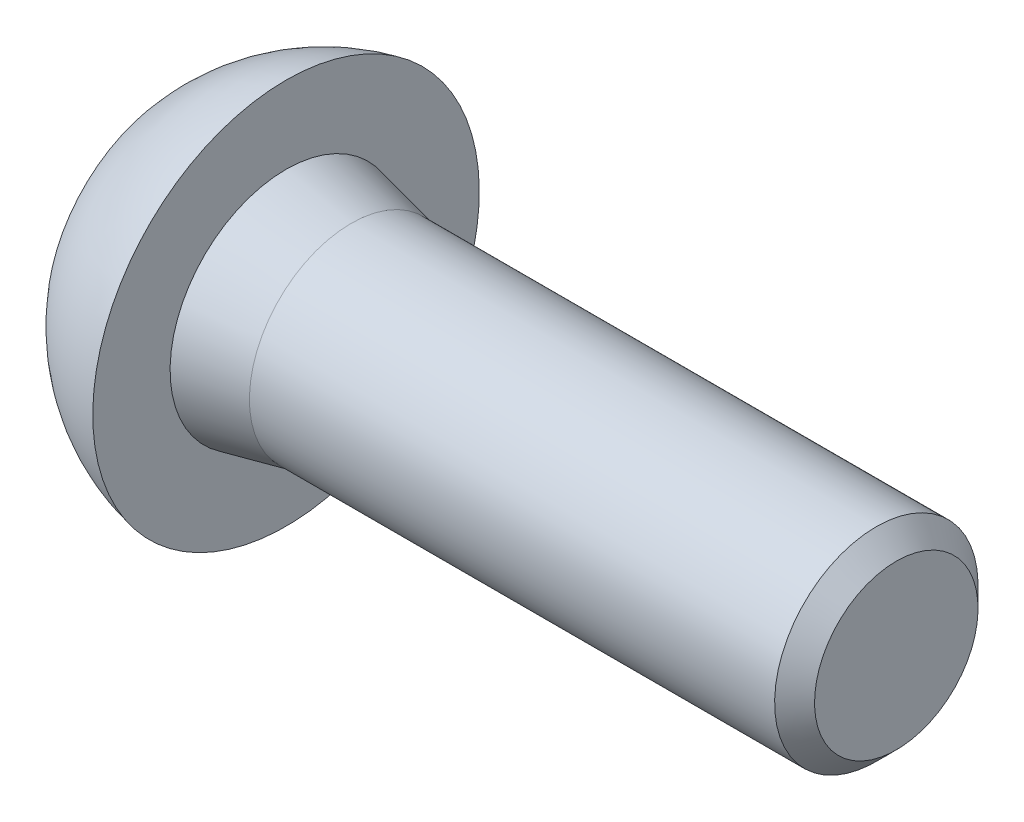
ISO-10303-21;
HEADER;
FILE_DESCRIPTION(('STEP AP214'),'2;1');
FILE_NAME('part.step','',(''),(''),'','','');
FILE_SCHEMA(('AUTOMOTIVE_DESIGN { 1 0 10303 214 1 1 1 1 }'));
ENDSEC;
DATA;
#1=APPLICATION_CONTEXT('core data for automotive mechanical design processes');
#2=APPLICATION_PROTOCOL_DEFINITION('international standard','automotive_design',2000,#1);
#3=PRODUCT_CONTEXT('',#1,'mechanical');
#4=PRODUCT('Part','Part','',(#3));
#5=PRODUCT_RELATED_PRODUCT_CATEGORY('part','',(#4));
#6=PRODUCT_DEFINITION_FORMATION('','',#4);
#7=PRODUCT_DEFINITION_CONTEXT('part definition',#1,'design');
#8=PRODUCT_DEFINITION('design','',#6,#7);
#9=PRODUCT_DEFINITION_SHAPE('','',#8);
#10=(LENGTH_UNIT() NAMED_UNIT(*) SI_UNIT(.MILLI.,.METRE.));
#11=(NAMED_UNIT(*) PLANE_ANGLE_UNIT() SI_UNIT($,.RADIAN.));
#12=(NAMED_UNIT(*) SI_UNIT($,.STERADIAN.) SOLID_ANGLE_UNIT());
#13=UNCERTAINTY_MEASURE_WITH_UNIT(LENGTH_MEASURE(1.E-05),#10,'distance_accuracy_value','');
#14=(GEOMETRIC_REPRESENTATION_CONTEXT(3) GLOBAL_UNCERTAINTY_ASSIGNED_CONTEXT((#13)) GLOBAL_UNIT_ASSIGNED_CONTEXT((#10,
#11,#12)) REPRESENTATION_CONTEXT('',''));
#15=CARTESIAN_POINT('',(0.,0.,0.));
#16=DIRECTION('',(0.,0.,1.));
#17=DIRECTION('',(1.,0.,0.));
#18=AXIS2_PLACEMENT_3D('',#15,#16,#17);
#19=CARTESIAN_POINT('',(-2.75,1.5,0.));
#20=DIRECTION('',(1.,0.,0.));
#21=DIRECTION('',(0.,1.,0.));
#22=AXIS2_PLACEMENT_3D('',#19,#20,#21);
#23=PLANE('',#22);
#24=CARTESIAN_POINT('',(-2.75,0.,0.));
#25=DIRECTION('',(1.,0.,0.));
#26=DIRECTION('',(0.,1.,0.));
#27=AXIS2_PLACEMENT_3D('',#24,#25,#26);
#28=CIRCLE('',#27,3.125);
#29=CARTESIAN_POINT('',(-2.75,3.125,0.));
#30=VERTEX_POINT('',#29);
#31=EDGE_CURVE('E134',#30,#30,#28,.T.);
#32=ORIENTED_EDGE('',*,*,#31,.F.);
#33=EDGE_LOOP('',(#32));
#34=FACE_BOUND('',#33,.T.);
#35=DIRECTION('',(0.,-0.5,0.866025403784439));
#36=VECTOR('',#35,1.);
#37=CARTESIAN_POINT('',(-2.75,-0.924038105676658,-1.39951905283833));
#38=LINE('',#37,#36);
#39=CARTESIAN_POINT('',(-2.75,-0.866025403784439,-1.5));
#40=VERTEX_POINT('',#39);
#41=CARTESIAN_POINT('',(-2.75,-1.73205080756888,0.));
#42=VERTEX_POINT('',#41);
#43=EDGE_CURVE('E11',#40,#42,#38,.T.);
#44=ORIENTED_EDGE('',*,*,#43,.F.);
#45=DIRECTION('',(0.,-1.,0.));
#46=VECTOR('',#45,1.);
#47=CARTESIAN_POINT('',(-2.75,1.5,-1.5));
#48=LINE('',#47,#46);
#49=CARTESIAN_POINT('',(-2.75,0.866025403784438,-1.5));
#50=VERTEX_POINT('',#49);
#51=EDGE_CURVE('E147',#50,#40,#48,.T.);
#52=ORIENTED_EDGE('',*,*,#51,.F.);
#53=DIRECTION('',(0.,-0.5,-0.866025403784439));
#54=VECTOR('',#53,1.);
#55=CARTESIAN_POINT('',(-2.75,1.67403810567666,-0.100480947161671));
#56=LINE('',#55,#54);
#57=CARTESIAN_POINT('',(-2.75,1.73205080756888,0.));
#58=VERTEX_POINT('',#57);
#59=EDGE_CURVE('E143',#58,#50,#56,.T.);
#60=ORIENTED_EDGE('',*,*,#59,.F.);
#61=DIRECTION('',(0.,0.5,-0.866025403784439));
#62=VECTOR('',#61,1.);
#63=CARTESIAN_POINT('',(-2.75,1.67403810567666,0.100480947161671));
#64=LINE('',#63,#62);
#65=CARTESIAN_POINT('',(-2.75,0.866025403784439,1.5));
#66=VERTEX_POINT('',#65);
#67=EDGE_CURVE('E140',#66,#58,#64,.T.);
#68=ORIENTED_EDGE('',*,*,#67,.F.);
#69=DIRECTION('',(0.,1.,0.));
#70=VECTOR('',#69,1.);
#71=CARTESIAN_POINT('',(-2.75,1.5,1.5));
#72=LINE('',#71,#70);
#73=CARTESIAN_POINT('',(-2.75,-0.866025403784439,1.5));
#74=VERTEX_POINT('',#73);
#75=EDGE_CURVE('E145',#74,#66,#72,.T.);
#76=ORIENTED_EDGE('',*,*,#75,.F.);
#77=DIRECTION('',(0.,0.5,0.866025403784439));
#78=VECTOR('',#77,1.);
#79=CARTESIAN_POINT('',(-2.75,-0.924038105676658,1.39951905283833));
#80=LINE('',#79,#78);
#81=EDGE_CURVE('E24',#42,#74,#80,.T.);
#82=ORIENTED_EDGE('',*,*,#81,.F.);
#83=EDGE_LOOP('',(#44,#52,#60,#68,#76,#82));
#84=FACE_BOUND('',#83,.T.);
#85=ADVANCED_FACE('F16',(#34,#84),#23,.F.);
#86=CARTESIAN_POINT('',(0.900773085666185,0.,0.));
#87=DIRECTION('',(1.,0.,0.));
#88=DIRECTION('',(0.,1.,0.));
#89=AXIS2_PLACEMENT_3D('',#86,#87,#88);
#90=DEGENERATE_TOROIDAL_SURFACE('',#89,0.0861917011802991,4.75000000000001,.T.);
#91=ORIENTED_EDGE('',*,*,#31,.T.);
#92=EDGE_LOOP('',(#91));
#93=FACE_BOUND('',#92,.T.);
#94=CARTESIAN_POINT('',(0.,0.,0.));
#95=DIRECTION('',(1.,0.,0.));
#96=DIRECTION('',(0.,1.,0.));
#97=AXIS2_PLACEMENT_3D('',#94,#95,#96);
#98=CIRCLE('',#97,4.75);
#99=CARTESIAN_POINT('',(0.,4.75,0.));
#100=VERTEX_POINT('',#99);
#101=EDGE_CURVE('E131',#100,#100,#98,.T.);
#102=ORIENTED_EDGE('',*,*,#101,.F.);
#103=EDGE_LOOP('',(#102));
#104=FACE_BOUND('',#103,.T.);
#105=ADVANCED_FACE('F219',(#93,#104),#90,.T.);
#106=CARTESIAN_POINT('',(0.,4.75,0.));
#107=DIRECTION('',(-1.,0.,0.));
#108=DIRECTION('',(0.,-1.,0.));
#109=AXIS2_PLACEMENT_3D('',#106,#107,#108);
#110=PLANE('',#109);
#111=CARTESIAN_POINT('',(0.,0.,0.));
#112=DIRECTION('',(1.,0.,0.));
#113=DIRECTION('',(0.,1.,0.));
#114=AXIS2_PLACEMENT_3D('',#111,#112,#113);
#115=CIRCLE('',#114,2.85);
#116=CARTESIAN_POINT('',(0.,2.85,0.));
#117=VERTEX_POINT('',#116);
#118=EDGE_CURVE('E128',#117,#117,#115,.T.);
#119=ORIENTED_EDGE('',*,*,#118,.F.);
#120=EDGE_LOOP('',(#119));
#121=FACE_BOUND('',#120,.T.);
#122=ORIENTED_EDGE('',*,*,#101,.T.);
#123=EDGE_LOOP('',(#122));
#124=FACE_BOUND('',#123,.T.);
#125=ADVANCED_FACE('F224',(#121,#124),#110,.F.);
#126=CARTESIAN_POINT('',(0.,0.,0.));
#127=DIRECTION('',(-1.,0.,0.));
#128=DIRECTION('',(0.,-1.,0.));
#129=AXIS2_PLACEMENT_3D('',#126,#127,#128);
#130=CONICAL_SURFACE('',#129,2.85,0.215357699697738);
#131=CARTESIAN_POINT('',(1.6,0.,0.));
#132=DIRECTION('',(1.,0.,0.));
#133=DIRECTION('',(0.,1.,0.));
#134=AXIS2_PLACEMENT_3D('',#131,#132,#133);
#135=CIRCLE('',#134,2.5);
#136=CARTESIAN_POINT('',(1.6,2.5,0.));
#137=VERTEX_POINT('',#136);
#138=EDGE_CURVE('E125',#137,#137,#135,.T.);
#139=ORIENTED_EDGE('',*,*,#138,.F.);
#140=EDGE_LOOP('',(#139));
#141=FACE_BOUND('',#140,.T.);
#142=ORIENTED_EDGE('',*,*,#118,.T.);
#143=EDGE_LOOP('',(#142));
#144=FACE_BOUND('',#143,.T.);
#145=ADVANCED_FACE('F231',(#141,#144),#130,.T.);
#146=CARTESIAN_POINT('',(15.,0.,0.));
#147=DIRECTION('',(1.,0.,0.));
#148=DIRECTION('',(0.,1.,0.));
#149=AXIS2_PLACEMENT_3D('',#146,#147,#148);
#150=CYLINDRICAL_SURFACE('',#149,2.5);
#151=CARTESIAN_POINT('',(14.5095,0.,0.));
#152=DIRECTION('',(1.,0.,0.));
#153=DIRECTION('',(0.,1.,0.));
#154=AXIS2_PLACEMENT_3D('',#151,#152,#153);
#155=CIRCLE('',#154,2.5);
#156=CARTESIAN_POINT('',(14.5095,2.5,0.));
#157=VERTEX_POINT('',#156);
#158=EDGE_CURVE('E117',#157,#157,#155,.T.);
#159=ORIENTED_EDGE('',*,*,#158,.F.);
#160=EDGE_LOOP('',(#159));
#161=FACE_BOUND('',#160,.T.);
#162=ORIENTED_EDGE('',*,*,#138,.T.);
#163=EDGE_LOOP('',(#162));
#164=FACE_BOUND('',#163,.T.);
#165=ADVANCED_FACE('F235',(#161,#164),#150,.T.);
#166=CARTESIAN_POINT('',(14.5095,0.,0.));
#167=DIRECTION('',(-1.,0.,0.));
#168=DIRECTION('',(0.,-1.,0.));
#169=AXIS2_PLACEMENT_3D('',#166,#167,#168);
#170=CONICAL_SURFACE('',#169,2.5,0.785398163397449);
#171=CARTESIAN_POINT('',(15.,0.,0.));
#172=DIRECTION('',(1.,0.,0.));
#173=DIRECTION('',(0.,1.,0.));
#174=AXIS2_PLACEMENT_3D('',#171,#172,#173);
#175=CIRCLE('',#174,2.0095);
#176=CARTESIAN_POINT('',(15.,2.0095,0.));
#177=VERTEX_POINT('',#176);
#178=EDGE_CURVE('E113',#177,#177,#175,.T.);
#179=ORIENTED_EDGE('',*,*,#178,.F.);
#180=EDGE_LOOP('',(#179));
#181=FACE_BOUND('',#180,.T.);
#182=ORIENTED_EDGE('',*,*,#158,.T.);
#183=EDGE_LOOP('',(#182));
#184=FACE_BOUND('',#183,.T.);
#185=ADVANCED_FACE('F239',(#181,#184),#170,.T.);
#186=CARTESIAN_POINT('',(15.,2.0095,0.));
#187=DIRECTION('',(-1.,0.,0.));
#188=DIRECTION('',(0.,-1.,0.));
#189=AXIS2_PLACEMENT_3D('',#186,#187,#188);
#190=PLANE('',#189);
#191=ORIENTED_EDGE('',*,*,#178,.T.);
#192=EDGE_LOOP('',(#191));
#193=FACE_BOUND('',#192,.T.);
#194=ADVANCED_FACE('F243',(#193),#190,.F.);
#195=CARTESIAN_POINT('',(-1.19,0.,0.));
#196=DIRECTION('',(1.,0.,0.));
#197=DIRECTION('',(0.,0.,-1.));
#198=AXIS2_PLACEMENT_3D('',#195,#196,#197);
#199=PLANE('',#198);
#200=DIRECTION('',(0.,1.,0.));
#201=VECTOR('',#200,1.);
#202=CARTESIAN_POINT('',(-1.19,-0.866025403784439,-1.5));
#203=LINE('',#202,#201);
#204=CARTESIAN_POINT('',(-1.19,-0.866025403784439,-1.5));
#205=VERTEX_POINT('',#204);
#206=CARTESIAN_POINT('',(-1.19,0.,-1.5));
#207=VERTEX_POINT('',#206);
#208=EDGE_CURVE('E31',#205,#207,#203,.T.);
#209=ORIENTED_EDGE('',*,*,#208,.F.);
#210=DIRECTION('',(0.,0.5,-0.866025403784439));
#211=VECTOR('',#210,1.);
#212=CARTESIAN_POINT('',(-1.19,-1.73205080756888,0.));
#213=LINE('',#212,#211);
#214=CARTESIAN_POINT('',(-1.19,-1.29903810567666,-0.75));
#215=VERTEX_POINT('',#214);
#216=EDGE_CURVE('E107',#215,#205,#213,.T.);
#217=ORIENTED_EDGE('',*,*,#216,.F.);
#218=CARTESIAN_POINT('',(-1.19,0.,0.));
#219=DIRECTION('',(1.,0.,0.));
#220=DIRECTION('',(0.,1.,0.));
#221=AXIS2_PLACEMENT_3D('',#218,#219,#220);
#222=CIRCLE('',#221,1.5);
#223=EDGE_CURVE('E192',#215,#207,#222,.T.);
#224=ORIENTED_EDGE('',*,*,#223,.T.);
#225=EDGE_LOOP('',(#209,#217,#224));
#226=FACE_BOUND('',#225,.T.);
#227=ADVANCED_FACE('F195',(#226),#199,.F.);
#228=CARTESIAN_POINT('',(-1.19,-1.73205080756888,0.));
#229=VERTEX_POINT('',#228);
#230=EDGE_CURVE('E185',#229,#215,#213,.T.);
#231=ORIENTED_EDGE('',*,*,#230,.F.);
#232=DIRECTION('',(0.,-0.5,-0.866025403784439));
#233=VECTOR('',#232,1.);
#234=CARTESIAN_POINT('',(-1.19,-0.866025403784439,1.5));
#235=LINE('',#234,#233);
#236=CARTESIAN_POINT('',(-1.19,-1.29903810567666,0.75));
#237=VERTEX_POINT('',#236);
#238=EDGE_CURVE('E108',#237,#229,#235,.T.);
#239=ORIENTED_EDGE('',*,*,#238,.F.);
#240=EDGE_CURVE('E190',#237,#215,#222,.T.);
#241=ORIENTED_EDGE('',*,*,#240,.T.);
#242=EDGE_LOOP('',(#231,#239,#241));
#243=FACE_BOUND('',#242,.T.);
#244=ADVANCED_FACE('F189',(#243),#199,.F.);
#245=CARTESIAN_POINT('',(-1.19,-0.866025403784439,1.5));
#246=VERTEX_POINT('',#245);
#247=EDGE_CURVE('E101',#246,#237,#235,.T.);
#248=ORIENTED_EDGE('',*,*,#247,.F.);
#249=DIRECTION('',(0.,-1.,0.));
#250=VECTOR('',#249,1.);
#251=CARTESIAN_POINT('',(-1.19,0.866025403784439,1.5));
#252=LINE('',#251,#250);
#253=CARTESIAN_POINT('',(-1.19,0.,1.5));
#254=VERTEX_POINT('',#253);
#255=EDGE_CURVE('E88',#254,#246,#252,.T.);
#256=ORIENTED_EDGE('',*,*,#255,.F.);
#257=EDGE_CURVE('E103',#254,#237,#222,.T.);
#258=ORIENTED_EDGE('',*,*,#257,.T.);
#259=EDGE_LOOP('',(#248,#256,#258));
#260=FACE_BOUND('',#259,.T.);
#261=ADVANCED_FACE('F102',(#260),#199,.F.);
#262=CARTESIAN_POINT('',(-1.19,0.866025403784439,1.5));
#263=VERTEX_POINT('',#262);
#264=EDGE_CURVE('E96',#263,#254,#252,.T.);
#265=ORIENTED_EDGE('',*,*,#264,.F.);
#266=DIRECTION('',(0.,-0.5,0.866025403784439));
#267=VECTOR('',#266,1.);
#268=CARTESIAN_POINT('',(-1.19,1.73205080756888,0.));
#269=LINE('',#268,#267);
#270=CARTESIAN_POINT('',(-1.19,1.29903810567666,0.75));
#271=VERTEX_POINT('',#270);
#272=EDGE_CURVE('E171',#271,#263,#269,.T.);
#273=ORIENTED_EDGE('',*,*,#272,.F.);
#274=EDGE_CURVE('E141',#271,#254,#222,.T.);
#275=ORIENTED_EDGE('',*,*,#274,.T.);
#276=EDGE_LOOP('',(#265,#273,#275));
#277=FACE_BOUND('',#276,.T.);
#278=ADVANCED_FACE('F209',(#277),#199,.F.);
#279=CARTESIAN_POINT('',(-1.19,1.73205080756888,0.));
#280=VERTEX_POINT('',#279);
#281=EDGE_CURVE('E173',#280,#271,#269,.T.);
#282=ORIENTED_EDGE('',*,*,#281,.F.);
#283=DIRECTION('',(0.,0.5,0.866025403784439));
#284=VECTOR('',#283,1.);
#285=CARTESIAN_POINT('',(-1.19,0.866025403784439,-1.5));
#286=LINE('',#285,#284);
#287=CARTESIAN_POINT('',(-1.19,1.29903810567666,-0.75));
#288=VERTEX_POINT('',#287);
#289=EDGE_CURVE('E182',#288,#280,#286,.T.);
#290=ORIENTED_EDGE('',*,*,#289,.F.);
#291=EDGE_CURVE('E138',#288,#271,#222,.T.);
#292=ORIENTED_EDGE('',*,*,#291,.T.);
#293=EDGE_LOOP('',(#282,#290,#292));
#294=FACE_BOUND('',#293,.T.);
#295=ADVANCED_FACE('F205',(#294),#199,.F.);
#296=CARTESIAN_POINT('',(-1.19,0.866025403784438,-1.5));
#297=VERTEX_POINT('',#296);
#298=EDGE_CURVE('E179',#297,#288,#286,.T.);
#299=ORIENTED_EDGE('',*,*,#298,.F.);
#300=EDGE_CURVE('E184',#207,#297,#203,.T.);
#301=ORIENTED_EDGE('',*,*,#300,.F.);
#302=EDGE_CURVE('E137',#207,#288,#222,.T.);
#303=ORIENTED_EDGE('',*,*,#302,.T.);
#304=EDGE_LOOP('',(#299,#301,#303));
#305=FACE_BOUND('',#304,.T.);
#306=ADVANCED_FACE('F202',(#305),#199,.F.);
#307=CARTESIAN_POINT('',(-1.19,0.866025403784439,1.5));
#308=DIRECTION('',(0.,0.,-1.));
#309=DIRECTION('',(-1.,0.,0.));
#310=AXIS2_PLACEMENT_3D('',#307,#308,#309);
#311=PLANE('',#310);
#312=ORIENTED_EDGE('',*,*,#264,.T.);
#313=ORIENTED_EDGE('',*,*,#255,.T.);
#314=DIRECTION('',(-1.,0.,0.));
#315=VECTOR('',#314,1.);
#316=CARTESIAN_POINT('',(-1.19,-0.866025403784439,1.5));
#317=LINE('',#316,#315);
#318=EDGE_CURVE('E92',#246,#74,#317,.T.);
#319=ORIENTED_EDGE('',*,*,#318,.T.);
#320=ORIENTED_EDGE('',*,*,#75,.T.);
#321=DIRECTION('',(-1.,0.,0.));
#322=VECTOR('',#321,1.);
#323=CARTESIAN_POINT('',(-1.19,0.866025403784439,1.5));
#324=LINE('',#323,#322);
#325=EDGE_CURVE('E164',#263,#66,#324,.T.);
#326=ORIENTED_EDGE('',*,*,#325,.F.);
#327=EDGE_LOOP('',(#312,#313,#319,#320,#326));
#328=FACE_BOUND('',#327,.T.);
#329=ADVANCED_FACE('F90',(#328),#311,.T.);
#330=CARTESIAN_POINT('',(-1.19,-0.866025403784439,1.5));
#331=DIRECTION('',(0.,0.866025403784439,-0.5));
#332=DIRECTION('',(0.,0.5,0.866025403784439));
#333=AXIS2_PLACEMENT_3D('',#330,#331,#332);
#334=PLANE('',#333);
#335=ORIENTED_EDGE('',*,*,#247,.T.);
#336=ORIENTED_EDGE('',*,*,#238,.T.);
#337=DIRECTION('',(-1.,0.,0.));
#338=VECTOR('',#337,1.);
#339=CARTESIAN_POINT('',(-1.19,-1.73205080756888,0.));
#340=LINE('',#339,#338);
#341=EDGE_CURVE('E114',#229,#42,#340,.T.);
#342=ORIENTED_EDGE('',*,*,#341,.T.);
#343=ORIENTED_EDGE('',*,*,#81,.T.);
#344=ORIENTED_EDGE('',*,*,#318,.F.);
#345=EDGE_LOOP('',(#335,#336,#342,#343,#344));
#346=FACE_BOUND('',#345,.T.);
#347=ADVANCED_FACE('F110',(#346),#334,.T.);
#348=CARTESIAN_POINT('',(-1.19,-1.73205080756888,0.));
#349=DIRECTION('',(0.,0.866025403784439,0.5));
#350=DIRECTION('',(0.,-0.5,0.866025403784439));
#351=AXIS2_PLACEMENT_3D('',#348,#349,#350);
#352=PLANE('',#351);
#353=ORIENTED_EDGE('',*,*,#230,.T.);
#354=ORIENTED_EDGE('',*,*,#216,.T.);
#355=DIRECTION('',(-1.,0.,0.));
#356=VECTOR('',#355,1.);
#357=CARTESIAN_POINT('',(-1.19,-0.866025403784439,-1.5));
#358=LINE('',#357,#356);
#359=EDGE_CURVE('E119',#205,#40,#358,.T.);
#360=ORIENTED_EDGE('',*,*,#359,.T.);
#361=ORIENTED_EDGE('',*,*,#43,.T.);
#362=ORIENTED_EDGE('',*,*,#341,.F.);
#363=EDGE_LOOP('',(#353,#354,#360,#361,#362));
#364=FACE_BOUND('',#363,.T.);
#365=ADVANCED_FACE('F159',(#364),#352,.T.);
#366=CARTESIAN_POINT('',(-1.19,-0.866025403784439,-1.5));
#367=DIRECTION('',(0.,0.,1.));
#368=DIRECTION('',(1.,0.,0.));
#369=AXIS2_PLACEMENT_3D('',#366,#367,#368);
#370=PLANE('',#369);
#371=ORIENTED_EDGE('',*,*,#208,.T.);
#372=ORIENTED_EDGE('',*,*,#300,.T.);
#373=DIRECTION('',(-1.,0.,0.));
#374=VECTOR('',#373,1.);
#375=CARTESIAN_POINT('',(-1.19,0.866025403784438,-1.5));
#376=LINE('',#375,#374);
#377=EDGE_CURVE('E153',#297,#50,#376,.T.);
#378=ORIENTED_EDGE('',*,*,#377,.T.);
#379=ORIENTED_EDGE('',*,*,#51,.T.);
#380=ORIENTED_EDGE('',*,*,#359,.F.);
#381=EDGE_LOOP('',(#371,#372,#378,#379,#380));
#382=FACE_BOUND('',#381,.T.);
#383=ADVANCED_FACE('F151',(#382),#370,.T.);
#384=CARTESIAN_POINT('',(-1.19,0.866025403784439,-1.5));
#385=DIRECTION('',(0.,-0.866025403784439,0.5));
#386=DIRECTION('',(0.,-0.5,-0.866025403784439));
#387=AXIS2_PLACEMENT_3D('',#384,#385,#386);
#388=PLANE('',#387);
#389=ORIENTED_EDGE('',*,*,#298,.T.);
#390=ORIENTED_EDGE('',*,*,#289,.T.);
#391=DIRECTION('',(-1.,0.,0.));
#392=VECTOR('',#391,1.);
#393=CARTESIAN_POINT('',(-1.19,1.73205080756888,0.));
#394=LINE('',#393,#392);
#395=EDGE_CURVE('E172',#280,#58,#394,.T.);
#396=ORIENTED_EDGE('',*,*,#395,.T.);
#397=ORIENTED_EDGE('',*,*,#59,.T.);
#398=ORIENTED_EDGE('',*,*,#377,.F.);
#399=EDGE_LOOP('',(#389,#390,#396,#397,#398));
#400=FACE_BOUND('',#399,.T.);
#401=ADVANCED_FACE('F207',(#400),#388,.T.);
#402=CARTESIAN_POINT('',(-1.19,1.73205080756888,0.));
#403=DIRECTION('',(0.,-0.866025403784439,-0.5));
#404=DIRECTION('',(0.,0.5,-0.866025403784439));
#405=AXIS2_PLACEMENT_3D('',#402,#403,#404);
#406=PLANE('',#405);
#407=ORIENTED_EDGE('',*,*,#281,.T.);
#408=ORIENTED_EDGE('',*,*,#272,.T.);
#409=ORIENTED_EDGE('',*,*,#325,.T.);
#410=ORIENTED_EDGE('',*,*,#67,.T.);
#411=ORIENTED_EDGE('',*,*,#395,.F.);
#412=EDGE_LOOP('',(#407,#408,#409,#410,#411));
#413=FACE_BOUND('',#412,.T.);
#414=ADVANCED_FACE('F167',(#413),#406,.T.);
#415=CARTESIAN_POINT('',(-0.323974596215561,0.,0.));
#416=DIRECTION('',(-1.,0.,0.));
#417=DIRECTION('',(0.,-1.,0.));
#418=AXIS2_PLACEMENT_3D('',#415,#416,#417);
#419=CONICAL_SURFACE('',#418,0.,1.0471975511966);
#420=ORIENTED_EDGE('',*,*,#291,.F.);
#421=ORIENTED_EDGE('',*,*,#302,.F.);
#422=ORIENTED_EDGE('',*,*,#223,.F.);
#423=ORIENTED_EDGE('',*,*,#240,.F.);
#424=ORIENTED_EDGE('',*,*,#257,.F.);
#425=ORIENTED_EDGE('',*,*,#274,.F.);
#426=EDGE_LOOP('',(#420,#421,#422,#423,#424,#425));
#427=FACE_BOUND('',#426,.T.);
#428=CARTESIAN_POINT('',(-0.323974596215561,0.,0.));
#429=VERTEX_POINT('',#428);
#430=VERTEX_LOOP('',#429);
#431=FACE_BOUND('',#430,.T.);
#432=ADVANCED_FACE('F18',(#427,#431),#419,.F.);
#433=CLOSED_SHELL('',(#85,#105,#125,#145,#165,#185,#194,#227,#244,#261,#278,#295,#306,#329,#347,
#365,#383,#401,#414,#432));
#434=MANIFOLD_SOLID_BREP('B1',#433);
#435=ADVANCED_BREP_SHAPE_REPRESENTATION('',(#18,#434),#14);
#436=SHAPE_DEFINITION_REPRESENTATION(#9,#435);
ENDSEC;
END-ISO-10303-21;
